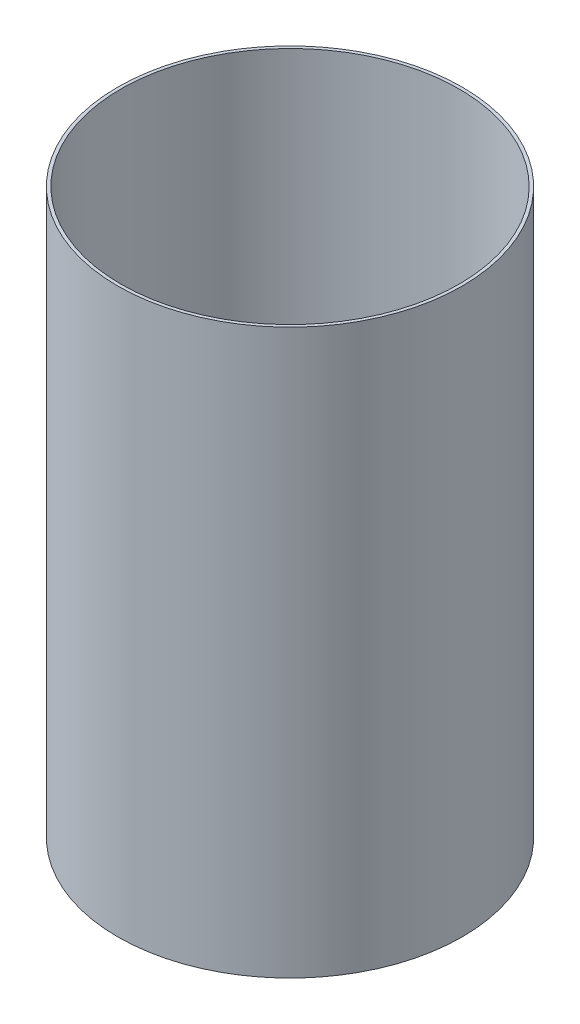
ISO-10303-21;
HEADER;
FILE_DESCRIPTION(('STEP AP214'),'2;1');
FILE_NAME('part.step','',(''),(''),'','','');
FILE_SCHEMA(('AUTOMOTIVE_DESIGN { 1 0 10303 214 1 1 1 1 }'));
ENDSEC;
DATA;
#1=APPLICATION_CONTEXT('core data for automotive mechanical design processes');
#2=APPLICATION_PROTOCOL_DEFINITION('international standard','automotive_design',2000,#1);
#3=PRODUCT_CONTEXT('',#1,'mechanical');
#4=PRODUCT('Part','Part','',(#3));
#5=PRODUCT_RELATED_PRODUCT_CATEGORY('part','',(#4));
#6=PRODUCT_DEFINITION_FORMATION('','',#4);
#7=PRODUCT_DEFINITION_CONTEXT('part definition',#1,'design');
#8=PRODUCT_DEFINITION('design','',#6,#7);
#9=PRODUCT_DEFINITION_SHAPE('','',#8);
#10=(LENGTH_UNIT() NAMED_UNIT(*) SI_UNIT(.MILLI.,.METRE.));
#11=(NAMED_UNIT(*) PLANE_ANGLE_UNIT() SI_UNIT($,.RADIAN.));
#12=(NAMED_UNIT(*) SI_UNIT($,.STERADIAN.) SOLID_ANGLE_UNIT());
#13=UNCERTAINTY_MEASURE_WITH_UNIT(LENGTH_MEASURE(1.E-05),#10,'distance_accuracy_value','');
#14=(GEOMETRIC_REPRESENTATION_CONTEXT(3) GLOBAL_UNCERTAINTY_ASSIGNED_CONTEXT((#13)) GLOBAL_UNIT_ASSIGNED_CONTEXT((#10,
#11,#12)) REPRESENTATION_CONTEXT('',''));
#15=CARTESIAN_POINT('',(0.,0.,0.));
#16=DIRECTION('',(0.,0.,1.));
#17=DIRECTION('',(1.,0.,0.));
#18=AXIS2_PLACEMENT_3D('',#15,#16,#17);
#19=CARTESIAN_POINT('',(0.,254.,0.));
#20=DIRECTION('',(0.,1.,0.));
#21=DIRECTION('',(0.,0.,1.));
#22=AXIS2_PLACEMENT_3D('',#19,#20,#21);
#23=PLANE('',#22);
#24=CARTESIAN_POINT('',(0.,254.,0.));
#25=DIRECTION('',(0.,1.,0.));
#26=DIRECTION('',(0.,0.,1.));
#27=AXIS2_PLACEMENT_3D('',#24,#25,#26);
#28=CIRCLE('',#27,77.6224);
#29=CARTESIAN_POINT('',(0.,254.,77.6224));
#30=VERTEX_POINT('',#29);
#31=EDGE_CURVE('E10',#30,#30,#28,.T.);
#32=ORIENTED_EDGE('',*,*,#31,.T.);
#33=EDGE_LOOP('',(#32));
#34=FACE_BOUND('',#33,.T.);
#35=CARTESIAN_POINT('',(0.,254.,0.));
#36=DIRECTION('',(0.,1.,0.));
#37=DIRECTION('',(0.,0.,1.));
#38=AXIS2_PLACEMENT_3D('',#35,#36,#37);
#39=CIRCLE('',#38,76.2);
#40=CARTESIAN_POINT('',(0.,254.,76.2));
#41=VERTEX_POINT('',#40);
#42=EDGE_CURVE('E42',#41,#41,#39,.T.);
#43=ORIENTED_EDGE('',*,*,#42,.F.);
#44=EDGE_LOOP('',(#43));
#45=FACE_BOUND('',#44,.T.);
#46=ADVANCED_FACE('F31',(#34,#45),#23,.T.);
#47=CARTESIAN_POINT('',(0.,0.,0.));
#48=DIRECTION('',(0.,1.,0.));
#49=DIRECTION('',(0.,0.,1.));
#50=AXIS2_PLACEMENT_3D('',#47,#48,#49);
#51=PLANE('',#50);
#52=CARTESIAN_POINT('',(0.,0.,0.));
#53=DIRECTION('',(0.,1.,0.));
#54=DIRECTION('',(0.,0.,1.));
#55=AXIS2_PLACEMENT_3D('',#52,#53,#54);
#56=CIRCLE('',#55,77.6224);
#57=CARTESIAN_POINT('',(0.,0.,77.6224));
#58=VERTEX_POINT('',#57);
#59=EDGE_CURVE('E35',#58,#58,#56,.T.);
#60=ORIENTED_EDGE('',*,*,#59,.F.);
#61=EDGE_LOOP('',(#60));
#62=FACE_BOUND('',#61,.T.);
#63=CARTESIAN_POINT('',(0.,0.,0.));
#64=DIRECTION('',(0.,1.,0.));
#65=DIRECTION('',(0.,0.,1.));
#66=AXIS2_PLACEMENT_3D('',#63,#64,#65);
#67=CIRCLE('',#66,76.2);
#68=CARTESIAN_POINT('',(0.,0.,76.2));
#69=VERTEX_POINT('',#68);
#70=EDGE_CURVE('E44',#69,#69,#67,.T.);
#71=ORIENTED_EDGE('',*,*,#70,.T.);
#72=EDGE_LOOP('',(#71));
#73=FACE_BOUND('',#72,.T.);
#74=ADVANCED_FACE('F54',(#62,#73),#51,.F.);
#75=CARTESIAN_POINT('',(0.,254.,0.));
#76=DIRECTION('',(0.,-1.,0.));
#77=DIRECTION('',(0.,0.,-1.));
#78=AXIS2_PLACEMENT_3D('',#75,#76,#77);
#79=CYLINDRICAL_SURFACE('',#78,77.6224);
#80=ORIENTED_EDGE('',*,*,#31,.F.);
#81=EDGE_LOOP('',(#80));
#82=FACE_BOUND('',#81,.T.);
#83=ORIENTED_EDGE('',*,*,#59,.T.);
#84=EDGE_LOOP('',(#83));
#85=FACE_BOUND('',#84,.T.);
#86=ADVANCED_FACE('F33',(#82,#85),#79,.T.);
#87=CARTESIAN_POINT('',(0.,254.,0.));
#88=DIRECTION('',(0.,-1.,0.));
#89=DIRECTION('',(0.,0.,-1.));
#90=AXIS2_PLACEMENT_3D('',#87,#88,#89);
#91=CYLINDRICAL_SURFACE('',#90,76.2);
#92=ORIENTED_EDGE('',*,*,#42,.T.);
#93=EDGE_LOOP('',(#92));
#94=FACE_BOUND('',#93,.T.);
#95=ORIENTED_EDGE('',*,*,#70,.F.);
#96=EDGE_LOOP('',(#95));
#97=FACE_BOUND('',#96,.T.);
#98=ADVANCED_FACE('F50',(#94,#97),#91,.F.);
#99=CLOSED_SHELL('',(#46,#74,#86,#98));
#100=MANIFOLD_SOLID_BREP('B2',#99);
#101=ADVANCED_BREP_SHAPE_REPRESENTATION('',(#18,#100),#14);
#102=SHAPE_DEFINITION_REPRESENTATION(#9,#101);
ENDSEC;
END-ISO-10303-21;
